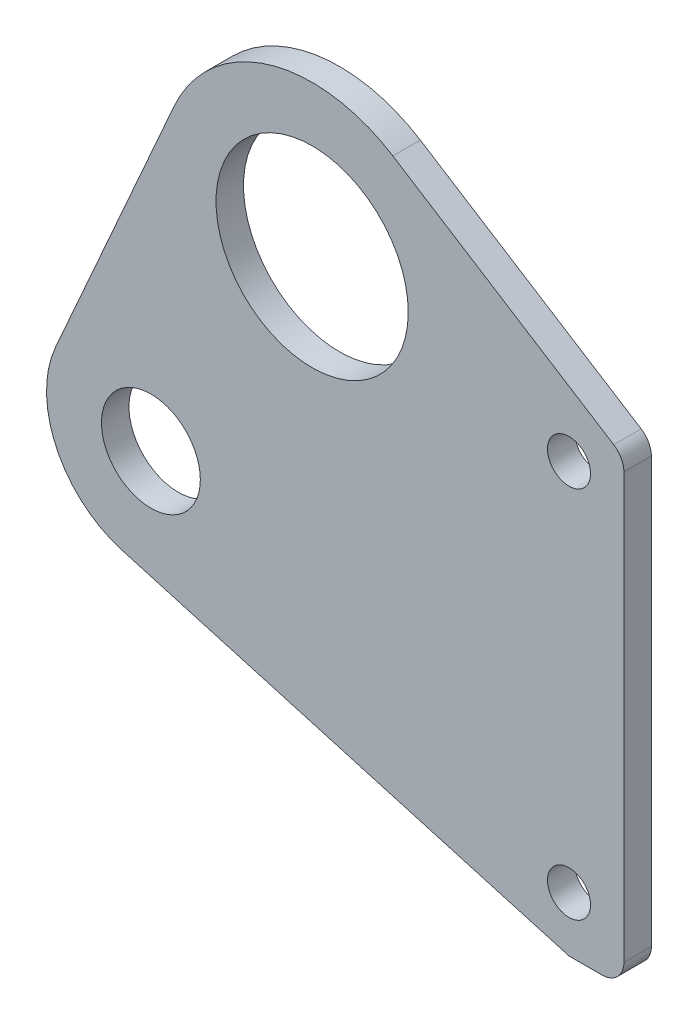
ISO-10303-21;
HEADER;
FILE_DESCRIPTION(('STEP AP214'),'2;1');
FILE_NAME('part.step','',(''),(''),'','','');
FILE_SCHEMA(('AUTOMOTIVE_DESIGN { 1 0 10303 214 1 1 1 1 }'));
ENDSEC;
DATA;
#1=APPLICATION_CONTEXT('core data for automotive mechanical design processes');
#2=APPLICATION_PROTOCOL_DEFINITION('international standard','automotive_design',2000,#1);
#3=PRODUCT_CONTEXT('',#1,'mechanical');
#4=PRODUCT('Part','Part','',(#3));
#5=PRODUCT_RELATED_PRODUCT_CATEGORY('part','',(#4));
#6=PRODUCT_DEFINITION_FORMATION('','',#4);
#7=PRODUCT_DEFINITION_CONTEXT('part definition',#1,'design');
#8=PRODUCT_DEFINITION('design','',#6,#7);
#9=PRODUCT_DEFINITION_SHAPE('','',#8);
#10=(LENGTH_UNIT() NAMED_UNIT(*) SI_UNIT(.MILLI.,.METRE.));
#11=(NAMED_UNIT(*) PLANE_ANGLE_UNIT() SI_UNIT($,.RADIAN.));
#12=(NAMED_UNIT(*) SI_UNIT($,.STERADIAN.) SOLID_ANGLE_UNIT());
#13=UNCERTAINTY_MEASURE_WITH_UNIT(LENGTH_MEASURE(1.E-05),#10,'distance_accuracy_value','');
#14=(GEOMETRIC_REPRESENTATION_CONTEXT(3) GLOBAL_UNCERTAINTY_ASSIGNED_CONTEXT((#13)) GLOBAL_UNIT_ASSIGNED_CONTEXT((#10,
#11,#12)) REPRESENTATION_CONTEXT('',''));
#15=CARTESIAN_POINT('',(0.,0.,0.));
#16=DIRECTION('',(0.,0.,1.));
#17=DIRECTION('',(1.,0.,0.));
#18=AXIS2_PLACEMENT_3D('',#15,#16,#17);
#19=CARTESIAN_POINT('',(38.1,-38.1,3.175));
#20=DIRECTION('',(0.,1.,0.));
#21=DIRECTION('',(0.,0.,1.));
#22=AXIS2_PLACEMENT_3D('',#19,#20,#21);
#23=PLANE('',#22);
#24=DIRECTION('',(1.,0.,0.));
#25=VECTOR('',#24,1.);
#26=CARTESIAN_POINT('',(38.1,-38.1,0.));
#27=LINE('',#26,#25);
#28=CARTESIAN_POINT('',(31.75,-38.1,0.));
#29=VERTEX_POINT('',#28);
#30=CARTESIAN_POINT('',(35.56,-38.1,0.));
#31=VERTEX_POINT('',#30);
#32=EDGE_CURVE('E217',#29,#31,#27,.T.);
#33=ORIENTED_EDGE('',*,*,#32,.T.);
#34=DIRECTION('',(0.,0.,-1.));
#35=VECTOR('',#34,1.);
#36=CARTESIAN_POINT('',(35.56,-38.1,3.175));
#37=LINE('',#36,#35);
#38=CARTESIAN_POINT('',(35.56,-38.1,3.175));
#39=VERTEX_POINT('',#38);
#40=EDGE_CURVE('E69',#31,#39,#37,.F.);
#41=ORIENTED_EDGE('',*,*,#40,.T.);
#42=DIRECTION('',(1.,0.,0.));
#43=VECTOR('',#42,1.);
#44=CARTESIAN_POINT('',(38.1,-38.1,3.175));
#45=LINE('',#44,#43);
#46=CARTESIAN_POINT('',(31.75,-38.1,3.175));
#47=VERTEX_POINT('',#46);
#48=EDGE_CURVE('E218',#47,#39,#45,.T.);
#49=ORIENTED_EDGE('',*,*,#48,.F.);
#50=DIRECTION('',(0.,0.,1.));
#51=VECTOR('',#50,1.);
#52=CARTESIAN_POINT('',(31.75,-38.1,0.));
#53=LINE('',#52,#51);
#54=EDGE_CURVE('E129',#29,#47,#53,.T.);
#55=ORIENTED_EDGE('',*,*,#54,.F.);
#56=EDGE_LOOP('',(#33,#41,#49,#55));
#57=FACE_BOUND('',#56,.T.);
#58=ADVANCED_FACE('F45',(#57),#23,.F.);
#59=CARTESIAN_POINT('',(38.1,-38.1,3.175));
#60=DIRECTION('',(-1.,0.,0.));
#61=DIRECTION('',(0.,0.,1.));
#62=AXIS2_PLACEMENT_3D('',#59,#60,#61);
#63=PLANE('',#62);
#64=DIRECTION('',(0.,1.,0.));
#65=VECTOR('',#64,1.);
#66=CARTESIAN_POINT('',(38.1,-38.1,3.175));
#67=LINE('',#66,#65);
#68=CARTESIAN_POINT('',(38.1,-35.56,3.175));
#69=VERTEX_POINT('',#68);
#70=CARTESIAN_POINT('',(38.1,13.5284183807728,3.175));
#71=VERTEX_POINT('',#70);
#72=EDGE_CURVE('E221',#69,#71,#67,.T.);
#73=ORIENTED_EDGE('',*,*,#72,.F.);
#74=DIRECTION('',(0.,0.,-1.));
#75=VECTOR('',#74,1.);
#76=CARTESIAN_POINT('',(38.1,-35.56,3.175));
#77=LINE('',#76,#75);
#78=CARTESIAN_POINT('',(38.1,-35.56,0.));
#79=VERTEX_POINT('',#78);
#80=EDGE_CURVE('E234',#69,#79,#77,.T.);
#81=ORIENTED_EDGE('',*,*,#80,.T.);
#82=DIRECTION('',(0.,1.,0.));
#83=VECTOR('',#82,1.);
#84=CARTESIAN_POINT('',(38.1,-38.1,0.));
#85=LINE('',#84,#83);
#86=CARTESIAN_POINT('',(38.1,13.5284183807728,0.));
#87=VERTEX_POINT('',#86);
#88=EDGE_CURVE('E222',#79,#87,#85,.T.);
#89=ORIENTED_EDGE('',*,*,#88,.T.);
#90=DIRECTION('',(0.,0.,1.));
#91=VECTOR('',#90,1.);
#92=CARTESIAN_POINT('',(38.1,13.5284183807728,3.175));
#93=LINE('',#92,#91);
#94=EDGE_CURVE('E225',#87,#71,#93,.T.);
#95=ORIENTED_EDGE('',*,*,#94,.T.);
#96=EDGE_LOOP('',(#73,#81,#89,#95));
#97=FACE_BOUND('',#96,.T.);
#98=ADVANCED_FACE('F255',(#97),#63,.F.);
#99=CARTESIAN_POINT('',(0.,0.,3.175));
#100=DIRECTION('',(0.,0.,-1.));
#101=DIRECTION('',(-1.,0.,0.));
#102=AXIS2_PLACEMENT_3D('',#99,#100,#101);
#103=PLANE('',#102);
#104=CARTESIAN_POINT('',(-16.5874040807486,-11.7176176470588,3.175));
#105=DIRECTION('',(0.,0.,1.));
#106=DIRECTION('',(1.,0.,0.));
#107=AXIS2_PLACEMENT_3D('',#104,#105,#106);
#108=CIRCLE('',#107,5.715);
#109=CARTESIAN_POINT('',(-10.8724040807486,-11.7176176470588,3.175));
#110=VERTEX_POINT('',#109);
#111=EDGE_CURVE('E191',#110,#110,#108,.T.);
#112=ORIENTED_EDGE('',*,*,#111,.F.);
#113=EDGE_LOOP('',(#112));
#114=FACE_BOUND('',#113,.T.);
#115=CARTESIAN_POINT('',(2.05351660433529,17.062934397897,3.175));
#116=DIRECTION('',(0.,0.,1.));
#117=DIRECTION('',(1.,0.,0.));
#118=AXIS2_PLACEMENT_3D('',#115,#116,#117);
#119=CIRCLE('',#118,11.1125);
#120=CARTESIAN_POINT('',(13.1660166043353,17.062934397897,3.175));
#121=VERTEX_POINT('',#120);
#122=EDGE_CURVE('E195',#121,#121,#119,.T.);
#123=ORIENTED_EDGE('',*,*,#122,.F.);
#124=EDGE_LOOP('',(#123));
#125=FACE_BOUND('',#124,.T.);
#126=CARTESIAN_POINT('',(31.75,11.43,3.175));
#127=DIRECTION('',(0.,0.,1.));
#128=DIRECTION('',(1.,0.,0.));
#129=AXIS2_PLACEMENT_3D('',#126,#127,#128);
#130=CIRCLE('',#129,2.48919999999999);
#131=CARTESIAN_POINT('',(34.2392,11.43,3.175));
#132=VERTEX_POINT('',#131);
#133=EDGE_CURVE('E190',#132,#132,#130,.T.);
#134=ORIENTED_EDGE('',*,*,#133,.F.);
#135=EDGE_LOOP('',(#134));
#136=FACE_BOUND('',#135,.T.);
#137=CARTESIAN_POINT('',(31.75,-31.75,3.175));
#138=DIRECTION('',(0.,0.,1.));
#139=DIRECTION('',(1.,0.,0.));
#140=AXIS2_PLACEMENT_3D('',#137,#138,#139);
#141=CIRCLE('',#140,2.48919999999999);
#142=CARTESIAN_POINT('',(34.2392,-31.75,3.175));
#143=VERTEX_POINT('',#142);
#144=EDGE_CURVE('E209',#143,#143,#141,.T.);
#145=ORIENTED_EDGE('',*,*,#144,.F.);
#146=EDGE_LOOP('',(#145));
#147=FACE_BOUND('',#146,.T.);
#148=ORIENTED_EDGE('',*,*,#48,.T.);
#149=CARTESIAN_POINT('',(35.56,-35.56,3.175));
#150=DIRECTION('',(0.,0.,-1.));
#151=DIRECTION('',(-1.,0.,0.));
#152=AXIS2_PLACEMENT_3D('',#149,#150,#151);
#153=CIRCLE('',#152,2.54);
#154=EDGE_CURVE('E54',#39,#69,#153,.F.);
#155=ORIENTED_EDGE('',*,*,#154,.T.);
#156=ORIENTED_EDGE('',*,*,#72,.T.);
#157=CARTESIAN_POINT('',(35.56,13.5284183807728,3.175));
#158=DIRECTION('',(0.,0.,-1.));
#159=DIRECTION('',(-1.,0.,0.));
#160=AXIS2_PLACEMENT_3D('',#157,#158,#159);
#161=CIRCLE('',#160,2.54);
#162=CARTESIAN_POINT('',(36.9176688111774,15.6751217601795,3.175));
#163=VERTEX_POINT('',#162);
#164=EDGE_CURVE('E61',#71,#163,#161,.F.);
#165=ORIENTED_EDGE('',*,*,#164,.T.);
#166=DIRECTION('',(0.845158810790037,-0.534515279991106,0.));
#167=VECTOR('',#166,1.);
#168=CARTESIAN_POINT('',(11.38748968118,31.821520131318,3.175));
#169=LINE('',#168,#167);
#170=CARTESIAN_POINT('',(11.38748968118,31.821520131318,3.175));
#171=VERTEX_POINT('',#170);
#172=EDGE_CURVE('E164',#171,#163,#169,.T.);
#173=ORIENTED_EDGE('',*,*,#172,.F.);
#174=CARTESIAN_POINT('',(2.0535166043353,17.062934397897,3.175));
#175=DIRECTION('',(0.,0.,-1.));
#176=DIRECTION('',(1.,0.,0.));
#177=AXIS2_PLACEMENT_3D('',#174,#175,#176);
#178=CIRCLE('',#177,17.4625);
#179=CARTESIAN_POINT('',(-13.9148093421993,24.130569979563,3.175));
#180=VERTEX_POINT('',#179);
#181=EDGE_CURVE('E126',#180,#171,#178,.T.);
#182=ORIENTED_EDGE('',*,*,#181,.F.);
#183=DIRECTION('',(0.404732173610076,0.914435272528823,0.));
#184=VECTOR('',#183,1.);
#185=CARTESIAN_POINT('',(-13.9148093421993,24.130569979563,3.175));
#186=LINE('',#185,#184);
#187=CARTESIAN_POINT('',(-27.6200656438089,-6.83452397245324,3.175));
#188=VERTEX_POINT('',#187);
#189=EDGE_CURVE('E147',#188,#180,#186,.T.);
#190=ORIENTED_EDGE('',*,*,#189,.F.);
#191=CARTESIAN_POINT('',(-16.5874040807486,-11.7176176470588,3.175));
#192=DIRECTION('',(0.,0.,-1.));
#193=DIRECTION('',(1.,0.,0.));
#194=AXIS2_PLACEMENT_3D('',#191,#192,#193);
#195=CIRCLE('',#194,12.065);
#196=CARTESIAN_POINT('',(-19.9068773128992,-23.3169849772642,3.175));
#197=VERTEX_POINT('',#196);
#198=EDGE_CURVE('E151',#197,#188,#195,.T.);
#199=ORIENTED_EDGE('',*,*,#198,.F.);
#200=DIRECTION('',(-0.961406326581464,0.275132468474978,0.));
#201=VECTOR('',#200,1.);
#202=CARTESIAN_POINT('',(-19.9068773128992,-23.3169849772642,3.175));
#203=LINE('',#202,#201);
#204=EDGE_CURVE('E167',#47,#197,#203,.T.);
#205=ORIENTED_EDGE('',*,*,#204,.F.);
#206=EDGE_LOOP('',(#148,#155,#156,#165,#173,#182,#190,#199,#205));
#207=FACE_BOUND('',#206,.T.);
#208=ADVANCED_FACE('F250',(#114,#125,#136,#147,#207),#103,.F.);
#209=CARTESIAN_POINT('',(0.,0.,0.));
#210=DIRECTION('',(0.,0.,-1.));
#211=DIRECTION('',(-1.,0.,0.));
#212=AXIS2_PLACEMENT_3D('',#209,#210,#211);
#213=PLANE('',#212);
#214=ORIENTED_EDGE('',*,*,#88,.F.);
#215=CARTESIAN_POINT('',(35.56,-35.56,0.));
#216=DIRECTION('',(0.,0.,-1.));
#217=DIRECTION('',(-1.,0.,0.));
#218=AXIS2_PLACEMENT_3D('',#215,#216,#217);
#219=CIRCLE('',#218,2.54);
#220=EDGE_CURVE('E241',#79,#31,#219,.T.);
#221=ORIENTED_EDGE('',*,*,#220,.T.);
#222=ORIENTED_EDGE('',*,*,#32,.F.);
#223=DIRECTION('',(-0.961406326581464,0.275132468474978,0.));
#224=VECTOR('',#223,1.);
#225=CARTESIAN_POINT('',(-19.9068773128992,-23.3169849772642,0.));
#226=LINE('',#225,#224);
#227=CARTESIAN_POINT('',(-19.9068773128992,-23.3169849772642,0.));
#228=VERTEX_POINT('',#227);
#229=EDGE_CURVE('E139',#29,#228,#226,.T.);
#230=ORIENTED_EDGE('',*,*,#229,.T.);
#231=CARTESIAN_POINT('',(-16.5874040807486,-11.7176176470588,0.));
#232=DIRECTION('',(0.,0.,-1.));
#233=DIRECTION('',(1.,0.,0.));
#234=AXIS2_PLACEMENT_3D('',#231,#232,#233);
#235=CIRCLE('',#234,12.065);
#236=CARTESIAN_POINT('',(-27.6200656438089,-6.83452397245324,0.));
#237=VERTEX_POINT('',#236);
#238=EDGE_CURVE('E157',#228,#237,#235,.T.);
#239=ORIENTED_EDGE('',*,*,#238,.T.);
#240=DIRECTION('',(0.404732173610076,0.914435272528823,0.));
#241=VECTOR('',#240,1.);
#242=CARTESIAN_POINT('',(-13.9148093421993,24.130569979563,0.));
#243=LINE('',#242,#241);
#244=CARTESIAN_POINT('',(-13.9148093421993,24.130569979563,0.));
#245=VERTEX_POINT('',#244);
#246=EDGE_CURVE('E130',#237,#245,#243,.T.);
#247=ORIENTED_EDGE('',*,*,#246,.T.);
#248=CARTESIAN_POINT('',(2.0535166043353,17.062934397897,0.));
#249=DIRECTION('',(0.,0.,-1.));
#250=DIRECTION('',(1.,0.,0.));
#251=AXIS2_PLACEMENT_3D('',#248,#249,#250);
#252=CIRCLE('',#251,17.4625);
#253=CARTESIAN_POINT('',(11.38748968118,31.821520131318,0.));
#254=VERTEX_POINT('',#253);
#255=EDGE_CURVE('E123',#245,#254,#252,.T.);
#256=ORIENTED_EDGE('',*,*,#255,.T.);
#257=DIRECTION('',(0.845158810790037,-0.534515279991106,0.));
#258=VECTOR('',#257,1.);
#259=CARTESIAN_POINT('',(11.38748968118,31.821520131318,0.));
#260=LINE('',#259,#258);
#261=CARTESIAN_POINT('',(36.9176688111774,15.6751217601795,0.));
#262=VERTEX_POINT('',#261);
#263=EDGE_CURVE('E133',#254,#262,#260,.T.);
#264=ORIENTED_EDGE('',*,*,#263,.T.);
#265=CARTESIAN_POINT('',(35.56,13.5284183807728,0.));
#266=DIRECTION('',(0.,0.,-1.));
#267=DIRECTION('',(-1.,0.,0.));
#268=AXIS2_PLACEMENT_3D('',#265,#266,#267);
#269=CIRCLE('',#268,2.54);
#270=EDGE_CURVE('E238',#262,#87,#269,.T.);
#271=ORIENTED_EDGE('',*,*,#270,.T.);
#272=EDGE_LOOP('',(#214,#221,#222,#230,#239,#247,#256,#264,#271));
#273=FACE_BOUND('',#272,.T.);
#274=CARTESIAN_POINT('',(-16.5874040807486,-11.7176176470588,0.));
#275=DIRECTION('',(0.,0.,1.));
#276=DIRECTION('',(1.,0.,0.));
#277=AXIS2_PLACEMENT_3D('',#274,#275,#276);
#278=CIRCLE('',#277,5.715);
#279=CARTESIAN_POINT('',(-10.8724040807486,-11.7176176470588,0.));
#280=VERTEX_POINT('',#279);
#281=EDGE_CURVE('E186',#280,#280,#278,.T.);
#282=ORIENTED_EDGE('',*,*,#281,.T.);
#283=EDGE_LOOP('',(#282));
#284=FACE_BOUND('',#283,.T.);
#285=CARTESIAN_POINT('',(2.05351660433529,17.062934397897,0.));
#286=DIRECTION('',(0.,0.,1.));
#287=DIRECTION('',(1.,0.,0.));
#288=AXIS2_PLACEMENT_3D('',#285,#286,#287);
#289=CIRCLE('',#288,11.1125);
#290=CARTESIAN_POINT('',(13.1660166043353,17.062934397897,0.));
#291=VERTEX_POINT('',#290);
#292=EDGE_CURVE('E177',#291,#291,#289,.T.);
#293=ORIENTED_EDGE('',*,*,#292,.T.);
#294=EDGE_LOOP('',(#293));
#295=FACE_BOUND('',#294,.T.);
#296=CARTESIAN_POINT('',(31.75,11.43,0.));
#297=DIRECTION('',(0.,0.,1.));
#298=DIRECTION('',(1.,0.,0.));
#299=AXIS2_PLACEMENT_3D('',#296,#297,#298);
#300=CIRCLE('',#299,2.4892);
#301=CARTESIAN_POINT('',(34.2392,11.43,0.));
#302=VERTEX_POINT('',#301);
#303=EDGE_CURVE('E205',#302,#302,#300,.T.);
#304=ORIENTED_EDGE('',*,*,#303,.T.);
#305=EDGE_LOOP('',(#304));
#306=FACE_BOUND('',#305,.T.);
#307=CARTESIAN_POINT('',(31.75,-31.75,0.));
#308=DIRECTION('',(0.,0.,1.));
#309=DIRECTION('',(1.,0.,0.));
#310=AXIS2_PLACEMENT_3D('',#307,#308,#309);
#311=CIRCLE('',#310,2.4892);
#312=CARTESIAN_POINT('',(34.2392,-31.75,0.));
#313=VERTEX_POINT('',#312);
#314=EDGE_CURVE('E213',#313,#313,#311,.T.);
#315=ORIENTED_EDGE('',*,*,#314,.T.);
#316=EDGE_LOOP('',(#315));
#317=FACE_BOUND('',#316,.T.);
#318=ADVANCED_FACE('F142',(#273,#284,#295,#306,#317),#213,.T.);
#319=CARTESIAN_POINT('',(31.75,-31.75,3.175));
#320=DIRECTION('',(0.,0.,1.));
#321=DIRECTION('',(1.,0.,0.));
#322=AXIS2_PLACEMENT_3D('',#319,#320,#321);
#323=CYLINDRICAL_SURFACE('',#322,2.48919999999999);
#324=ORIENTED_EDGE('',*,*,#314,.F.);
#325=EDGE_LOOP('',(#324));
#326=FACE_BOUND('',#325,.T.);
#327=ORIENTED_EDGE('',*,*,#144,.T.);
#328=EDGE_LOOP('',(#327));
#329=FACE_BOUND('',#328,.T.);
#330=ADVANCED_FACE('F284',(#326,#329),#323,.F.);
#331=CARTESIAN_POINT('',(31.75,11.43,3.175));
#332=DIRECTION('',(0.,0.,1.));
#333=DIRECTION('',(1.,0.,0.));
#334=AXIS2_PLACEMENT_3D('',#331,#332,#333);
#335=CYLINDRICAL_SURFACE('',#334,2.48919999999999);
#336=ORIENTED_EDGE('',*,*,#303,.F.);
#337=EDGE_LOOP('',(#336));
#338=FACE_BOUND('',#337,.T.);
#339=ORIENTED_EDGE('',*,*,#133,.T.);
#340=EDGE_LOOP('',(#339));
#341=FACE_BOUND('',#340,.T.);
#342=ADVANCED_FACE('F290',(#338,#341),#335,.F.);
#343=CARTESIAN_POINT('',(2.05351660433529,17.062934397897,0.));
#344=DIRECTION('',(0.,0.,1.));
#345=DIRECTION('',(1.,0.,0.));
#346=AXIS2_PLACEMENT_3D('',#343,#344,#345);
#347=CYLINDRICAL_SURFACE('',#346,11.1125);
#348=ORIENTED_EDGE('',*,*,#292,.F.);
#349=EDGE_LOOP('',(#348));
#350=FACE_BOUND('',#349,.T.);
#351=ORIENTED_EDGE('',*,*,#122,.T.);
#352=EDGE_LOOP('',(#351));
#353=FACE_BOUND('',#352,.T.);
#354=ADVANCED_FACE('F294',(#350,#353),#347,.F.);
#355=CARTESIAN_POINT('',(-16.5874040807486,-11.7176176470588,0.));
#356=DIRECTION('',(0.,0.,1.));
#357=DIRECTION('',(1.,0.,0.));
#358=AXIS2_PLACEMENT_3D('',#355,#356,#357);
#359=CYLINDRICAL_SURFACE('',#358,5.715);
#360=ORIENTED_EDGE('',*,*,#281,.F.);
#361=EDGE_LOOP('',(#360));
#362=FACE_BOUND('',#361,.T.);
#363=ORIENTED_EDGE('',*,*,#111,.T.);
#364=EDGE_LOOP('',(#363));
#365=FACE_BOUND('',#364,.T.);
#366=ADVANCED_FACE('F298',(#362,#365),#359,.F.);
#367=CARTESIAN_POINT('',(2.0535166043353,17.062934397897,0.));
#368=DIRECTION('',(0.,0.,1.));
#369=DIRECTION('',(1.,0.,0.));
#370=AXIS2_PLACEMENT_3D('',#367,#368,#369);
#371=CYLINDRICAL_SURFACE('',#370,17.4625);
#372=ORIENTED_EDGE('',*,*,#181,.T.);
#373=DIRECTION('',(0.,0.,1.));
#374=VECTOR('',#373,1.);
#375=CARTESIAN_POINT('',(11.38748968118,31.821520131318,0.));
#376=LINE('',#375,#374);
#377=EDGE_CURVE('E119',#254,#171,#376,.T.);
#378=ORIENTED_EDGE('',*,*,#377,.F.);
#379=ORIENTED_EDGE('',*,*,#255,.F.);
#380=DIRECTION('',(0.,0.,1.));
#381=VECTOR('',#380,1.);
#382=CARTESIAN_POINT('',(-13.9148093421993,24.130569979563,0.));
#383=LINE('',#382,#381);
#384=EDGE_CURVE('E174',#245,#180,#383,.T.);
#385=ORIENTED_EDGE('',*,*,#384,.T.);
#386=EDGE_LOOP('',(#372,#378,#379,#385));
#387=FACE_BOUND('',#386,.T.);
#388=ADVANCED_FACE('F121',(#387),#371,.T.);
#389=CARTESIAN_POINT('',(-13.9148093421993,24.130569979563,0.));
#390=DIRECTION('',(0.914435272528823,-0.404732173610076,0.));
#391=DIRECTION('',(0.404732173610076,0.914435272528823,0.));
#392=AXIS2_PLACEMENT_3D('',#389,#390,#391);
#393=PLANE('',#392);
#394=ORIENTED_EDGE('',*,*,#189,.T.);
#395=ORIENTED_EDGE('',*,*,#384,.F.);
#396=ORIENTED_EDGE('',*,*,#246,.F.);
#397=DIRECTION('',(0.,0.,1.));
#398=VECTOR('',#397,1.);
#399=CARTESIAN_POINT('',(-27.6200656438089,-6.83452397245324,0.));
#400=LINE('',#399,#398);
#401=EDGE_CURVE('E178',#237,#188,#400,.T.);
#402=ORIENTED_EDGE('',*,*,#401,.T.);
#403=EDGE_LOOP('',(#394,#395,#396,#402));
#404=FACE_BOUND('',#403,.T.);
#405=ADVANCED_FACE('F268',(#404),#393,.F.);
#406=CARTESIAN_POINT('',(-16.5874040807486,-11.7176176470588,0.));
#407=DIRECTION('',(0.,0.,1.));
#408=DIRECTION('',(1.,0.,0.));
#409=AXIS2_PLACEMENT_3D('',#406,#407,#408);
#410=CYLINDRICAL_SURFACE('',#409,12.065);
#411=ORIENTED_EDGE('',*,*,#198,.T.);
#412=ORIENTED_EDGE('',*,*,#401,.F.);
#413=ORIENTED_EDGE('',*,*,#238,.F.);
#414=DIRECTION('',(0.,0.,1.));
#415=VECTOR('',#414,1.);
#416=CARTESIAN_POINT('',(-19.9068773128992,-23.3169849772642,0.));
#417=LINE('',#416,#415);
#418=EDGE_CURVE('E181',#228,#197,#417,.T.);
#419=ORIENTED_EDGE('',*,*,#418,.T.);
#420=EDGE_LOOP('',(#411,#412,#413,#419));
#421=FACE_BOUND('',#420,.T.);
#422=ADVANCED_FACE('F265',(#421),#410,.T.);
#423=CARTESIAN_POINT('',(-19.9068773128992,-23.3169849772642,0.));
#424=DIRECTION('',(0.275132468474978,0.961406326581464,0.));
#425=DIRECTION('',(-0.961406326581464,0.275132468474978,0.));
#426=AXIS2_PLACEMENT_3D('',#423,#424,#425);
#427=PLANE('',#426);
#428=ORIENTED_EDGE('',*,*,#204,.T.);
#429=ORIENTED_EDGE('',*,*,#418,.F.);
#430=ORIENTED_EDGE('',*,*,#229,.F.);
#431=ORIENTED_EDGE('',*,*,#54,.T.);
#432=EDGE_LOOP('',(#428,#429,#430,#431));
#433=FACE_BOUND('',#432,.T.);
#434=ADVANCED_FACE('F261',(#433),#427,.F.);
#435=CARTESIAN_POINT('',(11.38748968118,31.821520131318,0.));
#436=DIRECTION('',(-0.534515279991106,-0.845158810790037,0.));
#437=DIRECTION('',(0.845158810790037,-0.534515279991106,0.));
#438=AXIS2_PLACEMENT_3D('',#435,#436,#437);
#439=PLANE('',#438);
#440=ORIENTED_EDGE('',*,*,#172,.T.);
#441=DIRECTION('',(0.,0.,1.));
#442=VECTOR('',#441,1.);
#443=CARTESIAN_POINT('',(36.9176688111774,15.6751217601795,0.));
#444=LINE('',#443,#442);
#445=EDGE_CURVE('E11',#163,#262,#444,.F.);
#446=ORIENTED_EDGE('',*,*,#445,.T.);
#447=ORIENTED_EDGE('',*,*,#263,.F.);
#448=ORIENTED_EDGE('',*,*,#377,.T.);
#449=EDGE_LOOP('',(#440,#446,#447,#448));
#450=FACE_BOUND('',#449,.T.);
#451=ADVANCED_FACE('F134',(#450),#439,.F.);
#452=CARTESIAN_POINT('',(35.56,-35.56,3.175));
#453=DIRECTION('',(0.,0.,-1.));
#454=DIRECTION('',(-1.,0.,0.));
#455=AXIS2_PLACEMENT_3D('',#452,#453,#454);
#456=CYLINDRICAL_SURFACE('',#455,2.54);
#457=ORIENTED_EDGE('',*,*,#154,.F.);
#458=ORIENTED_EDGE('',*,*,#40,.F.);
#459=ORIENTED_EDGE('',*,*,#220,.F.);
#460=ORIENTED_EDGE('',*,*,#80,.F.);
#461=EDGE_LOOP('',(#457,#458,#459,#460));
#462=FACE_BOUND('',#461,.T.);
#463=ADVANCED_FACE('F257',(#462),#456,.T.);
#464=CARTESIAN_POINT('',(35.56,13.5284183807728,3.175));
#465=DIRECTION('',(0.,0.,1.));
#466=DIRECTION('',(1.,0.,0.));
#467=AXIS2_PLACEMENT_3D('',#464,#465,#466);
#468=CYLINDRICAL_SURFACE('',#467,2.54);
#469=ORIENTED_EDGE('',*,*,#270,.F.);
#470=ORIENTED_EDGE('',*,*,#445,.F.);
#471=ORIENTED_EDGE('',*,*,#164,.F.);
#472=ORIENTED_EDGE('',*,*,#94,.F.);
#473=EDGE_LOOP('',(#469,#470,#471,#472));
#474=FACE_BOUND('',#473,.T.);
#475=ADVANCED_FACE('F47',(#474),#468,.T.);
#476=CLOSED_SHELL('',(#58,#98,#208,#318,#330,#342,#354,#366,#388,#405,#422,#434,#451,#463,#475));
#477=MANIFOLD_SOLID_BREP('B2',#476);
#478=ADVANCED_BREP_SHAPE_REPRESENTATION('',(#18,#477),#14);
#479=SHAPE_DEFINITION_REPRESENTATION(#9,#478);
ENDSEC;
END-ISO-10303-21;
